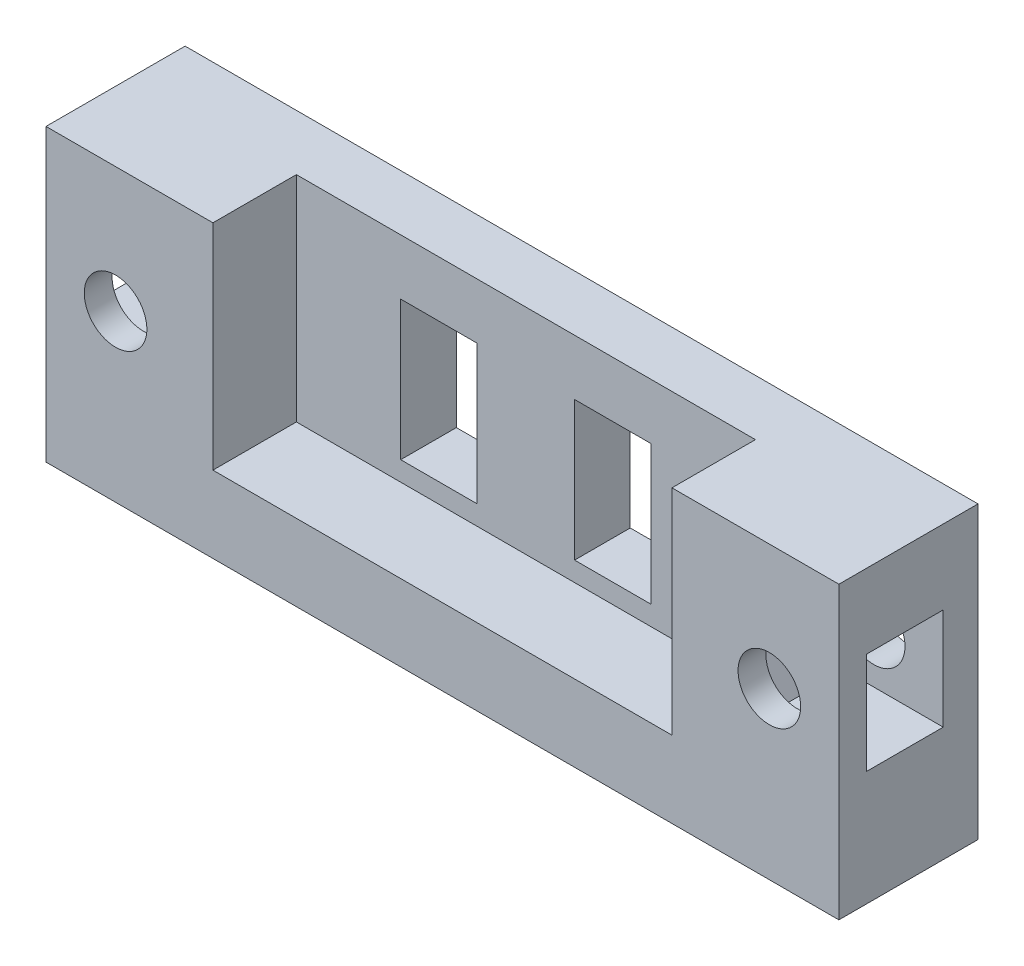
ISO-10303-21;
HEADER;
FILE_DESCRIPTION(('STEP AP214'),'2;1');
FILE_NAME('part.step','',(''),(''),'','','');
FILE_SCHEMA(('AUTOMOTIVE_DESIGN { 1 0 10303 214 1 1 1 1 }'));
ENDSEC;
DATA;
#1=APPLICATION_CONTEXT('core data for automotive mechanical design processes');
#2=APPLICATION_PROTOCOL_DEFINITION('international standard','automotive_design',2000,#1);
#3=PRODUCT_CONTEXT('',#1,'mechanical');
#4=PRODUCT('Part','Part','',(#3));
#5=PRODUCT_RELATED_PRODUCT_CATEGORY('part','',(#4));
#6=PRODUCT_DEFINITION_FORMATION('','',#4);
#7=PRODUCT_DEFINITION_CONTEXT('part definition',#1,'design');
#8=PRODUCT_DEFINITION('design','',#6,#7);
#9=PRODUCT_DEFINITION_SHAPE('','',#8);
#10=(LENGTH_UNIT() NAMED_UNIT(*) SI_UNIT(.MILLI.,.METRE.));
#11=(NAMED_UNIT(*) PLANE_ANGLE_UNIT() SI_UNIT($,.RADIAN.));
#12=(NAMED_UNIT(*) SI_UNIT($,.STERADIAN.) SOLID_ANGLE_UNIT());
#13=UNCERTAINTY_MEASURE_WITH_UNIT(LENGTH_MEASURE(1.E-05),#10,'distance_accuracy_value','');
#14=(GEOMETRIC_REPRESENTATION_CONTEXT(3) GLOBAL_UNCERTAINTY_ASSIGNED_CONTEXT((#13)) GLOBAL_UNIT_ASSIGNED_CONTEXT((#10,
#11,#12)) REPRESENTATION_CONTEXT('',''));
#15=CARTESIAN_POINT('',(0.,0.,0.));
#16=DIRECTION('',(0.,0.,1.));
#17=DIRECTION('',(1.,0.,0.));
#18=AXIS2_PLACEMENT_3D('',#15,#16,#17);
#19=CARTESIAN_POINT('',(0.,0.,4.));
#20=DIRECTION('',(1.,0.,0.));
#21=DIRECTION('',(0.,0.,-1.));
#22=AXIS2_PLACEMENT_3D('',#19,#20,#21);
#23=PLANE('',#22);
#24=DIRECTION('',(0.,-1.,0.));
#25=VECTOR('',#24,1.);
#26=CARTESIAN_POINT('',(0.,0.,0.));
#27=LINE('',#26,#25);
#28=CARTESIAN_POINT('',(0.,0.,0.));
#29=VERTEX_POINT('',#28);
#30=CARTESIAN_POINT('',(0.,-20.9,0.));
#31=VERTEX_POINT('',#30);
#32=EDGE_CURVE('E421',#29,#31,#27,.T.);
#33=ORIENTED_EDGE('',*,*,#32,.T.);
#34=DIRECTION('',(0.,0.,-1.));
#35=VECTOR('',#34,1.);
#36=CARTESIAN_POINT('',(0.,-20.9,4.));
#37=LINE('',#36,#35);
#38=CARTESIAN_POINT('',(0.,-20.9,10.));
#39=VERTEX_POINT('',#38);
#40=EDGE_CURVE('E11',#39,#31,#37,.T.);
#41=ORIENTED_EDGE('',*,*,#40,.F.);
#42=DIRECTION('',(0.,1.,0.));
#43=VECTOR('',#42,1.);
#44=CARTESIAN_POINT('',(0.,0.,10.));
#45=LINE('',#44,#43);
#46=CARTESIAN_POINT('',(0.,0.,10.));
#47=VERTEX_POINT('',#46);
#48=EDGE_CURVE('E269',#39,#47,#45,.T.);
#49=ORIENTED_EDGE('',*,*,#48,.T.);
#50=DIRECTION('',(0.,0.,-1.));
#51=VECTOR('',#50,1.);
#52=CARTESIAN_POINT('',(0.,0.,4.));
#53=LINE('',#52,#51);
#54=EDGE_CURVE('E424',#47,#29,#53,.T.);
#55=ORIENTED_EDGE('',*,*,#54,.T.);
#56=EDGE_LOOP('',(#33,#41,#49,#55));
#57=FACE_BOUND('',#56,.T.);
#58=DIRECTION('',(0.,1.,0.));
#59=VECTOR('',#58,1.);
#60=CARTESIAN_POINT('',(0.,0.,2.5));
#61=LINE('',#60,#59);
#62=CARTESIAN_POINT('',(0.,-12.65,2.5));
#63=VERTEX_POINT('',#62);
#64=CARTESIAN_POINT('',(0.,-5.35000000000004,2.5));
#65=VERTEX_POINT('',#64);
#66=EDGE_CURVE('E229',#63,#65,#61,.T.);
#67=ORIENTED_EDGE('',*,*,#66,.T.);
#68=DIRECTION('',(0.,0.,1.));
#69=VECTOR('',#68,1.);
#70=CARTESIAN_POINT('',(0.,-5.35000000000004,2.5));
#71=LINE('',#70,#69);
#72=CARTESIAN_POINT('',(0.,-5.35000000000004,8.));
#73=VERTEX_POINT('',#72);
#74=EDGE_CURVE('E212',#65,#73,#71,.T.);
#75=ORIENTED_EDGE('',*,*,#74,.T.);
#76=DIRECTION('',(0.,1.,0.));
#77=VECTOR('',#76,1.);
#78=CARTESIAN_POINT('',(0.,0.,8.));
#79=LINE('',#78,#77);
#80=CARTESIAN_POINT('',(0.,-12.65,8.));
#81=VERTEX_POINT('',#80);
#82=EDGE_CURVE('E245',#81,#73,#79,.T.);
#83=ORIENTED_EDGE('',*,*,#82,.F.);
#84=DIRECTION('',(0.,0.,1.));
#85=VECTOR('',#84,1.);
#86=CARTESIAN_POINT('',(0.,-12.65,2.5));
#87=LINE('',#86,#85);
#88=EDGE_CURVE('E51',#63,#81,#87,.T.);
#89=ORIENTED_EDGE('',*,*,#88,.F.);
#90=EDGE_LOOP('',(#67,#75,#83,#89));
#91=FACE_BOUND('',#90,.T.);
#92=ADVANCED_FACE('F37',(#57,#91),#23,.F.);
#93=CARTESIAN_POINT('',(5.,-9.,4.));
#94=DIRECTION('',(0.,0.,-1.));
#95=DIRECTION('',(-1.,0.,0.));
#96=AXIS2_PLACEMENT_3D('',#93,#94,#95);
#97=CYLINDRICAL_SURFACE('',#96,2.25);
#98=CARTESIAN_POINT('',(5.,-9.,0.));
#99=DIRECTION('',(0.,0.,1.));
#100=DIRECTION('',(1.,0.,0.));
#101=AXIS2_PLACEMENT_3D('',#98,#99,#100);
#102=CIRCLE('',#101,2.25);
#103=CARTESIAN_POINT('',(7.25,-9.,0.));
#104=VERTEX_POINT('',#103);
#105=EDGE_CURVE('E418',#104,#104,#102,.T.);
#106=ORIENTED_EDGE('',*,*,#105,.F.);
#107=EDGE_LOOP('',(#106));
#108=FACE_BOUND('',#107,.T.);
#109=CARTESIAN_POINT('',(5.,-9.,2.5));
#110=DIRECTION('',(0.,0.,-1.));
#111=DIRECTION('',(-1.,0.,0.));
#112=AXIS2_PLACEMENT_3D('',#109,#110,#111);
#113=CIRCLE('',#112,2.25);
#114=CARTESIAN_POINT('',(2.75,-9.,2.5));
#115=VERTEX_POINT('',#114);
#116=EDGE_CURVE('E231',#115,#115,#113,.F.);
#117=ORIENTED_EDGE('',*,*,#116,.T.);
#118=EDGE_LOOP('',(#117));
#119=FACE_BOUND('',#118,.T.);
#120=ADVANCED_FACE('F485',(#108,#119),#97,.F.);
#121=CARTESIAN_POINT('',(57.,0.,4.));
#122=DIRECTION('',(-1.,0.,0.));
#123=DIRECTION('',(0.,0.,1.));
#124=AXIS2_PLACEMENT_3D('',#121,#122,#123);
#125=PLANE('',#124);
#126=DIRECTION('',(0.,1.,0.));
#127=VECTOR('',#126,1.);
#128=CARTESIAN_POINT('',(57.,0.,0.));
#129=LINE('',#128,#127);
#130=CARTESIAN_POINT('',(57.,-20.9,0.));
#131=VERTEX_POINT('',#130);
#132=CARTESIAN_POINT('',(57.,0.,0.));
#133=VERTEX_POINT('',#132);
#134=EDGE_CURVE('E430',#131,#133,#129,.T.);
#135=ORIENTED_EDGE('',*,*,#134,.T.);
#136=DIRECTION('',(0.,0.,-1.));
#137=VECTOR('',#136,1.);
#138=CARTESIAN_POINT('',(57.,0.,4.));
#139=LINE('',#138,#137);
#140=CARTESIAN_POINT('',(57.,0.,10.));
#141=VERTEX_POINT('',#140);
#142=EDGE_CURVE('E435',#141,#133,#139,.T.);
#143=ORIENTED_EDGE('',*,*,#142,.F.);
#144=DIRECTION('',(0.,1.,0.));
#145=VECTOR('',#144,1.);
#146=CARTESIAN_POINT('',(57.,0.,10.));
#147=LINE('',#146,#145);
#148=CARTESIAN_POINT('',(57.,-20.9,10.));
#149=VERTEX_POINT('',#148);
#150=EDGE_CURVE('E333',#149,#141,#147,.T.);
#151=ORIENTED_EDGE('',*,*,#150,.F.);
#152=DIRECTION('',(0.,0.,-1.));
#153=VECTOR('',#152,1.);
#154=CARTESIAN_POINT('',(57.,-20.9,4.));
#155=LINE('',#154,#153);
#156=EDGE_CURVE('E44',#149,#131,#155,.T.);
#157=ORIENTED_EDGE('',*,*,#156,.T.);
#158=EDGE_LOOP('',(#135,#143,#151,#157));
#159=FACE_BOUND('',#158,.T.);
#160=DIRECTION('',(0.,1.,0.));
#161=VECTOR('',#160,1.);
#162=CARTESIAN_POINT('',(57.,0.,2.5));
#163=LINE('',#162,#161);
#164=CARTESIAN_POINT('',(57.,-12.65,2.5));
#165=VERTEX_POINT('',#164);
#166=CARTESIAN_POINT('',(57.,-5.35000000000004,2.5));
#167=VERTEX_POINT('',#166);
#168=EDGE_CURVE('E299',#165,#167,#163,.T.);
#169=ORIENTED_EDGE('',*,*,#168,.F.);
#170=DIRECTION('',(0.,0.,1.));
#171=VECTOR('',#170,1.);
#172=CARTESIAN_POINT('',(57.,-12.65,2.5));
#173=LINE('',#172,#171);
#174=CARTESIAN_POINT('',(57.,-12.65,8.));
#175=VERTEX_POINT('',#174);
#176=EDGE_CURVE('E322',#165,#175,#173,.T.);
#177=ORIENTED_EDGE('',*,*,#176,.T.);
#178=DIRECTION('',(0.,1.,0.));
#179=VECTOR('',#178,1.);
#180=CARTESIAN_POINT('',(57.,0.,8.));
#181=LINE('',#180,#179);
#182=CARTESIAN_POINT('',(57.,-5.35000000000003,8.));
#183=VERTEX_POINT('',#182);
#184=EDGE_CURVE('E287',#175,#183,#181,.T.);
#185=ORIENTED_EDGE('',*,*,#184,.T.);
#186=DIRECTION('',(0.,0.,1.));
#187=VECTOR('',#186,1.);
#188=CARTESIAN_POINT('',(57.,-5.35000000000004,2.5));
#189=LINE('',#188,#187);
#190=EDGE_CURVE('E318',#167,#183,#189,.T.);
#191=ORIENTED_EDGE('',*,*,#190,.F.);
#192=EDGE_LOOP('',(#169,#177,#185,#191));
#193=FACE_BOUND('',#192,.T.);
#194=ADVANCED_FACE('F441',(#159,#193),#125,.F.);
#195=CARTESIAN_POINT('',(52.,-9.,4.));
#196=DIRECTION('',(0.,0.,-1.));
#197=DIRECTION('',(-1.,0.,0.));
#198=AXIS2_PLACEMENT_3D('',#195,#196,#197);
#199=CYLINDRICAL_SURFACE('',#198,2.25);
#200=CARTESIAN_POINT('',(52.,-9.,0.));
#201=DIRECTION('',(0.,0.,1.));
#202=DIRECTION('',(1.,0.,0.));
#203=AXIS2_PLACEMENT_3D('',#200,#201,#202);
#204=CIRCLE('',#203,2.25);
#205=CARTESIAN_POINT('',(54.25,-9.,0.));
#206=VERTEX_POINT('',#205);
#207=EDGE_CURVE('E415',#206,#206,#204,.T.);
#208=ORIENTED_EDGE('',*,*,#207,.F.);
#209=EDGE_LOOP('',(#208));
#210=FACE_BOUND('',#209,.T.);
#211=CARTESIAN_POINT('',(52.,-9.,2.5));
#212=DIRECTION('',(0.,0.,1.));
#213=DIRECTION('',(1.,0.,0.));
#214=AXIS2_PLACEMENT_3D('',#211,#212,#213);
#215=CIRCLE('',#214,2.25);
#216=CARTESIAN_POINT('',(54.25,-9.,2.5));
#217=VERTEX_POINT('',#216);
#218=EDGE_CURVE('E283',#217,#217,#215,.F.);
#219=ORIENTED_EDGE('',*,*,#218,.F.);
#220=EDGE_LOOP('',(#219));
#221=FACE_BOUND('',#220,.T.);
#222=ADVANCED_FACE('F496',(#210,#221),#199,.F.);
#223=CARTESIAN_POINT('',(0.,0.,4.));
#224=DIRECTION('',(0.,0.,1.));
#225=DIRECTION('',(1.,0.,0.));
#226=AXIS2_PLACEMENT_3D('',#223,#224,#225);
#227=PLANE('',#226);
#228=DIRECTION('',(0.,-1.,0.));
#229=VECTOR('',#228,1.);
#230=CARTESIAN_POINT('',(12.,0.,4.));
#231=LINE('',#230,#229);
#232=CARTESIAN_POINT('',(12.,0.,4.));
#233=VERTEX_POINT('',#232);
#234=CARTESIAN_POINT('',(12.,-15.4,4.));
#235=VERTEX_POINT('',#234);
#236=EDGE_CURVE('E255',#233,#235,#231,.T.);
#237=ORIENTED_EDGE('',*,*,#236,.T.);
#238=DIRECTION('',(-1.,0.,0.));
#239=VECTOR('',#238,1.);
#240=CARTESIAN_POINT('',(0.,-15.4,4.));
#241=LINE('',#240,#239);
#242=CARTESIAN_POINT('',(45.,-15.4,4.));
#243=VERTEX_POINT('',#242);
#244=EDGE_CURVE('E59',#243,#235,#241,.T.);
#245=ORIENTED_EDGE('',*,*,#244,.F.);
#246=DIRECTION('',(0.,-1.,0.));
#247=VECTOR('',#246,1.);
#248=CARTESIAN_POINT('',(45.,0.,4.));
#249=LINE('',#248,#247);
#250=CARTESIAN_POINT('',(45.,0.,4.));
#251=VERTEX_POINT('',#250);
#252=EDGE_CURVE('E321',#251,#243,#249,.T.);
#253=ORIENTED_EDGE('',*,*,#252,.F.);
#254=DIRECTION('',(-1.,0.,0.));
#255=VECTOR('',#254,1.);
#256=CARTESIAN_POINT('',(0.,0.,4.));
#257=LINE('',#256,#255);
#258=EDGE_CURVE('E422',#251,#233,#257,.T.);
#259=ORIENTED_EDGE('',*,*,#258,.T.);
#260=EDGE_LOOP('',(#237,#245,#253,#259));
#261=FACE_BOUND('',#260,.T.);
#262=DIRECTION('',(-1.,0.,0.));
#263=VECTOR('',#262,1.);
#264=CARTESIAN_POINT('',(25.,-4.,4.));
#265=LINE('',#264,#263);
#266=CARTESIAN_POINT('',(25.,-4.,4.));
#267=VERTEX_POINT('',#266);
#268=CARTESIAN_POINT('',(19.5,-4.,4.));
#269=VERTEX_POINT('',#268);
#270=EDGE_CURVE('E356',#267,#269,#265,.T.);
#271=ORIENTED_EDGE('',*,*,#270,.F.);
#272=DIRECTION('',(0.,1.,0.));
#273=VECTOR('',#272,1.);
#274=CARTESIAN_POINT('',(25.,-4.,4.));
#275=LINE('',#274,#273);
#276=CARTESIAN_POINT('',(25.,-14.,4.));
#277=VERTEX_POINT('',#276);
#278=EDGE_CURVE('E354',#277,#267,#275,.T.);
#279=ORIENTED_EDGE('',*,*,#278,.F.);
#280=DIRECTION('',(1.,0.,0.));
#281=VECTOR('',#280,1.);
#282=CARTESIAN_POINT('',(25.,-14.,4.));
#283=LINE('',#282,#281);
#284=CARTESIAN_POINT('',(19.5,-14.,4.));
#285=VERTEX_POINT('',#284);
#286=EDGE_CURVE('E362',#285,#277,#283,.T.);
#287=ORIENTED_EDGE('',*,*,#286,.F.);
#288=DIRECTION('',(0.,-1.,0.));
#289=VECTOR('',#288,1.);
#290=CARTESIAN_POINT('',(19.5,-4.,4.));
#291=LINE('',#290,#289);
#292=EDGE_CURVE('E359',#269,#285,#291,.T.);
#293=ORIENTED_EDGE('',*,*,#292,.F.);
#294=EDGE_LOOP('',(#271,#279,#287,#293));
#295=FACE_BOUND('',#294,.T.);
#296=DIRECTION('',(-1.,0.,0.));
#297=VECTOR('',#296,1.);
#298=CARTESIAN_POINT('',(37.5,-4.,4.));
#299=LINE('',#298,#297);
#300=CARTESIAN_POINT('',(37.5,-4.,4.));
#301=VERTEX_POINT('',#300);
#302=CARTESIAN_POINT('',(32.,-4.,4.));
#303=VERTEX_POINT('',#302);
#304=EDGE_CURVE('E387',#301,#303,#299,.T.);
#305=ORIENTED_EDGE('',*,*,#304,.F.);
#306=DIRECTION('',(0.,1.,0.));
#307=VECTOR('',#306,1.);
#308=CARTESIAN_POINT('',(37.5,-4.,4.));
#309=LINE('',#308,#307);
#310=CARTESIAN_POINT('',(37.5,-14.,4.));
#311=VERTEX_POINT('',#310);
#312=EDGE_CURVE('E385',#311,#301,#309,.T.);
#313=ORIENTED_EDGE('',*,*,#312,.F.);
#314=DIRECTION('',(1.,0.,0.));
#315=VECTOR('',#314,1.);
#316=CARTESIAN_POINT('',(37.5,-14.,4.));
#317=LINE('',#316,#315);
#318=CARTESIAN_POINT('',(32.,-14.,4.));
#319=VERTEX_POINT('',#318);
#320=EDGE_CURVE('E393',#319,#311,#317,.T.);
#321=ORIENTED_EDGE('',*,*,#320,.F.);
#322=DIRECTION('',(0.,-1.,0.));
#323=VECTOR('',#322,1.);
#324=CARTESIAN_POINT('',(32.,-4.,4.));
#325=LINE('',#324,#323);
#326=EDGE_CURVE('E390',#303,#319,#325,.T.);
#327=ORIENTED_EDGE('',*,*,#326,.F.);
#328=EDGE_LOOP('',(#305,#313,#321,#327));
#329=FACE_BOUND('',#328,.T.);
#330=ADVANCED_FACE('F466',(#261,#295,#329),#227,.T.);
#331=CARTESIAN_POINT('',(0.,0.,0.));
#332=DIRECTION('',(0.,0.,1.));
#333=DIRECTION('',(1.,0.,0.));
#334=AXIS2_PLACEMENT_3D('',#331,#332,#333);
#335=PLANE('',#334);
#336=DIRECTION('',(0.,1.,0.));
#337=VECTOR('',#336,1.);
#338=CARTESIAN_POINT('',(37.5,-4.,0.));
#339=LINE('',#338,#337);
#340=CARTESIAN_POINT('',(37.5,-14.,0.));
#341=VERTEX_POINT('',#340);
#342=CARTESIAN_POINT('',(37.5,-4.,0.));
#343=VERTEX_POINT('',#342);
#344=EDGE_CURVE('E384',#341,#343,#339,.T.);
#345=ORIENTED_EDGE('',*,*,#344,.T.);
#346=DIRECTION('',(-1.,0.,0.));
#347=VECTOR('',#346,1.);
#348=CARTESIAN_POINT('',(37.5,-4.,0.));
#349=LINE('',#348,#347);
#350=CARTESIAN_POINT('',(32.,-4.,0.));
#351=VERTEX_POINT('',#350);
#352=EDGE_CURVE('E398',#343,#351,#349,.T.);
#353=ORIENTED_EDGE('',*,*,#352,.T.);
#354=DIRECTION('',(0.,-1.,0.));
#355=VECTOR('',#354,1.);
#356=CARTESIAN_POINT('',(32.,-4.,0.));
#357=LINE('',#356,#355);
#358=CARTESIAN_POINT('',(32.,-14.,0.));
#359=VERTEX_POINT('',#358);
#360=EDGE_CURVE('E401',#351,#359,#357,.T.);
#361=ORIENTED_EDGE('',*,*,#360,.T.);
#362=DIRECTION('',(1.,0.,0.));
#363=VECTOR('',#362,1.);
#364=CARTESIAN_POINT('',(37.5,-14.,0.));
#365=LINE('',#364,#363);
#366=EDGE_CURVE('E388',#359,#341,#365,.T.);
#367=ORIENTED_EDGE('',*,*,#366,.T.);
#368=EDGE_LOOP('',(#345,#353,#361,#367));
#369=FACE_BOUND('',#368,.T.);
#370=ORIENTED_EDGE('',*,*,#32,.F.);
#371=DIRECTION('',(-1.,0.,0.));
#372=VECTOR('',#371,1.);
#373=CARTESIAN_POINT('',(0.,0.,0.));
#374=LINE('',#373,#372);
#375=EDGE_CURVE('E425',#133,#29,#374,.T.);
#376=ORIENTED_EDGE('',*,*,#375,.F.);
#377=ORIENTED_EDGE('',*,*,#134,.F.);
#378=DIRECTION('',(1.,0.,0.));
#379=VECTOR('',#378,1.);
#380=CARTESIAN_POINT('',(0.,-20.9,0.));
#381=LINE('',#380,#379);
#382=EDGE_CURVE('E428',#31,#131,#381,.T.);
#383=ORIENTED_EDGE('',*,*,#382,.F.);
#384=EDGE_LOOP('',(#370,#376,#377,#383));
#385=FACE_BOUND('',#384,.T.);
#386=ORIENTED_EDGE('',*,*,#105,.T.);
#387=EDGE_LOOP('',(#386));
#388=FACE_BOUND('',#387,.T.);
#389=ORIENTED_EDGE('',*,*,#207,.T.);
#390=EDGE_LOOP('',(#389));
#391=FACE_BOUND('',#390,.T.);
#392=DIRECTION('',(0.,1.,0.));
#393=VECTOR('',#392,1.);
#394=CARTESIAN_POINT('',(25.,-4.,0.));
#395=LINE('',#394,#393);
#396=CARTESIAN_POINT('',(25.,-14.,0.));
#397=VERTEX_POINT('',#396);
#398=CARTESIAN_POINT('',(25.,-4.,0.));
#399=VERTEX_POINT('',#398);
#400=EDGE_CURVE('E353',#397,#399,#395,.T.);
#401=ORIENTED_EDGE('',*,*,#400,.T.);
#402=DIRECTION('',(-1.,0.,0.));
#403=VECTOR('',#402,1.);
#404=CARTESIAN_POINT('',(25.,-4.,0.));
#405=LINE('',#404,#403);
#406=CARTESIAN_POINT('',(19.5,-4.,0.));
#407=VERTEX_POINT('',#406);
#408=EDGE_CURVE('E367',#399,#407,#405,.T.);
#409=ORIENTED_EDGE('',*,*,#408,.T.);
#410=DIRECTION('',(0.,-1.,0.));
#411=VECTOR('',#410,1.);
#412=CARTESIAN_POINT('',(19.5,-4.,0.));
#413=LINE('',#412,#411);
#414=CARTESIAN_POINT('',(19.5,-14.,0.));
#415=VERTEX_POINT('',#414);
#416=EDGE_CURVE('E370',#407,#415,#413,.T.);
#417=ORIENTED_EDGE('',*,*,#416,.T.);
#418=DIRECTION('',(1.,0.,0.));
#419=VECTOR('',#418,1.);
#420=CARTESIAN_POINT('',(25.,-14.,0.));
#421=LINE('',#420,#419);
#422=EDGE_CURVE('E357',#415,#397,#421,.T.);
#423=ORIENTED_EDGE('',*,*,#422,.T.);
#424=EDGE_LOOP('',(#401,#409,#417,#423));
#425=FACE_BOUND('',#424,.T.);
#426=ADVANCED_FACE('F448',(#369,#385,#388,#391,#425),#335,.F.);
#427=CARTESIAN_POINT('',(0.,-20.9,4.));
#428=DIRECTION('',(0.,1.,0.));
#429=DIRECTION('',(0.,0.,1.));
#430=AXIS2_PLACEMENT_3D('',#427,#428,#429);
#431=PLANE('',#430);
#432=ORIENTED_EDGE('',*,*,#382,.T.);
#433=ORIENTED_EDGE('',*,*,#156,.F.);
#434=DIRECTION('',(1.,0.,0.));
#435=VECTOR('',#434,1.);
#436=CARTESIAN_POINT('',(0.,-20.9,10.));
#437=LINE('',#436,#435);
#438=EDGE_CURVE('E330',#39,#149,#437,.T.);
#439=ORIENTED_EDGE('',*,*,#438,.F.);
#440=ORIENTED_EDGE('',*,*,#40,.T.);
#441=EDGE_LOOP('',(#432,#433,#439,#440));
#442=FACE_BOUND('',#441,.T.);
#443=ADVANCED_FACE('F511',(#442),#431,.F.);
#444=CARTESIAN_POINT('',(0.,0.,4.));
#445=DIRECTION('',(0.,-1.,0.));
#446=DIRECTION('',(0.,0.,-1.));
#447=AXIS2_PLACEMENT_3D('',#444,#445,#446);
#448=PLANE('',#447);
#449=ORIENTED_EDGE('',*,*,#375,.T.);
#450=ORIENTED_EDGE('',*,*,#54,.F.);
#451=DIRECTION('',(1.,0.,0.));
#452=VECTOR('',#451,1.);
#453=CARTESIAN_POINT('',(57.,0.,10.));
#454=LINE('',#453,#452);
#455=CARTESIAN_POINT('',(12.,0.,10.));
#456=VERTEX_POINT('',#455);
#457=EDGE_CURVE('E266',#47,#456,#454,.T.);
#458=ORIENTED_EDGE('',*,*,#457,.T.);
#459=DIRECTION('',(0.,0.,-1.));
#460=VECTOR('',#459,1.);
#461=CARTESIAN_POINT('',(12.,0.,10.));
#462=LINE('',#461,#460);
#463=EDGE_CURVE('E275',#456,#233,#462,.T.);
#464=ORIENTED_EDGE('',*,*,#463,.T.);
#465=ORIENTED_EDGE('',*,*,#258,.F.);
#466=DIRECTION('',(0.,0.,-1.));
#467=VECTOR('',#466,1.);
#468=CARTESIAN_POINT('',(45.,0.,10.));
#469=LINE('',#468,#467);
#470=CARTESIAN_POINT('',(45.,0.,10.));
#471=VERTEX_POINT('',#470);
#472=EDGE_CURVE('E350',#471,#251,#469,.T.);
#473=ORIENTED_EDGE('',*,*,#472,.F.);
#474=DIRECTION('',(-1.,0.,0.));
#475=VECTOR('',#474,1.);
#476=CARTESIAN_POINT('',(0.,0.,10.));
#477=LINE('',#476,#475);
#478=EDGE_CURVE('E336',#141,#471,#477,.T.);
#479=ORIENTED_EDGE('',*,*,#478,.F.);
#480=ORIENTED_EDGE('',*,*,#142,.T.);
#481=EDGE_LOOP('',(#449,#450,#458,#464,#465,#473,#479,#480));
#482=FACE_BOUND('',#481,.T.);
#483=ADVANCED_FACE('F451',(#482),#448,.F.);
#484=CARTESIAN_POINT('',(5.,-9.,8.));
#485=DIRECTION('',(0.,0.,-1.));
#486=DIRECTION('',(-1.,0.,0.));
#487=AXIS2_PLACEMENT_3D('',#484,#485,#486);
#488=CIRCLE('',#487,2.25);
#489=CARTESIAN_POINT('',(2.75,-9.,8.));
#490=VERTEX_POINT('',#489);
#491=EDGE_CURVE('E241',#490,#490,#488,.F.);
#492=ORIENTED_EDGE('',*,*,#491,.F.);
#493=EDGE_LOOP('',(#492));
#494=FACE_BOUND('',#493,.T.);
#495=CARTESIAN_POINT('',(5.,-9.,10.));
#496=DIRECTION('',(0.,0.,-1.));
#497=DIRECTION('',(-1.,0.,0.));
#498=AXIS2_PLACEMENT_3D('',#495,#496,#497);
#499=CIRCLE('',#498,2.25);
#500=CARTESIAN_POINT('',(2.75,-9.,10.));
#501=VERTEX_POINT('',#500);
#502=EDGE_CURVE('E272',#501,#501,#499,.F.);
#503=ORIENTED_EDGE('',*,*,#502,.T.);
#504=EDGE_LOOP('',(#503));
#505=FACE_BOUND('',#504,.T.);
#506=ADVANCED_FACE('F492',(#494,#505),#97,.F.);
#507=CARTESIAN_POINT('',(52.,-9.,8.));
#508=DIRECTION('',(0.,0.,1.));
#509=DIRECTION('',(1.,0.,0.));
#510=AXIS2_PLACEMENT_3D('',#507,#508,#509);
#511=CIRCLE('',#510,2.25);
#512=CARTESIAN_POINT('',(54.25,-9.,8.));
#513=VERTEX_POINT('',#512);
#514=EDGE_CURVE('E282',#513,#513,#511,.F.);
#515=ORIENTED_EDGE('',*,*,#514,.T.);
#516=EDGE_LOOP('',(#515));
#517=FACE_BOUND('',#516,.T.);
#518=CARTESIAN_POINT('',(52.,-9.,10.));
#519=DIRECTION('',(0.,0.,1.));
#520=DIRECTION('',(1.,0.,0.));
#521=AXIS2_PLACEMENT_3D('',#518,#519,#520);
#522=CIRCLE('',#521,2.25);
#523=CARTESIAN_POINT('',(54.25,-9.,10.));
#524=VERTEX_POINT('',#523);
#525=EDGE_CURVE('E342',#524,#524,#522,.F.);
#526=ORIENTED_EDGE('',*,*,#525,.F.);
#527=EDGE_LOOP('',(#526));
#528=FACE_BOUND('',#527,.T.);
#529=ADVANCED_FACE('F503',(#517,#528),#199,.F.);
#530=CARTESIAN_POINT('',(37.5,-4.,4.));
#531=DIRECTION('',(-1.,0.,0.));
#532=DIRECTION('',(0.,-1.,0.));
#533=AXIS2_PLACEMENT_3D('',#530,#531,#532);
#534=PLANE('',#533);
#535=ORIENTED_EDGE('',*,*,#344,.F.);
#536=DIRECTION('',(0.,0.,-1.));
#537=VECTOR('',#536,1.);
#538=CARTESIAN_POINT('',(37.5,-14.,4.));
#539=LINE('',#538,#537);
#540=EDGE_CURVE('E395',#311,#341,#539,.T.);
#541=ORIENTED_EDGE('',*,*,#540,.F.);
#542=ORIENTED_EDGE('',*,*,#312,.T.);
#543=DIRECTION('',(0.,0.,-1.));
#544=VECTOR('',#543,1.);
#545=CARTESIAN_POINT('',(37.5,-4.,4.));
#546=LINE('',#545,#544);
#547=EDGE_CURVE('E412',#301,#343,#546,.T.);
#548=ORIENTED_EDGE('',*,*,#547,.T.);
#549=EDGE_LOOP('',(#535,#541,#542,#548));
#550=FACE_BOUND('',#549,.T.);
#551=ADVANCED_FACE('F509',(#550),#534,.T.);
#552=CARTESIAN_POINT('',(37.5,-4.,4.));
#553=DIRECTION('',(0.,-1.,0.));
#554=DIRECTION('',(1.,0.,0.));
#555=AXIS2_PLACEMENT_3D('',#552,#553,#554);
#556=PLANE('',#555);
#557=ORIENTED_EDGE('',*,*,#352,.F.);
#558=ORIENTED_EDGE('',*,*,#547,.F.);
#559=ORIENTED_EDGE('',*,*,#304,.T.);
#560=DIRECTION('',(0.,0.,-1.));
#561=VECTOR('',#560,1.);
#562=CARTESIAN_POINT('',(32.,-4.,4.));
#563=LINE('',#562,#561);
#564=EDGE_CURVE('E410',#303,#351,#563,.T.);
#565=ORIENTED_EDGE('',*,*,#564,.T.);
#566=EDGE_LOOP('',(#557,#558,#559,#565));
#567=FACE_BOUND('',#566,.T.);
#568=ADVANCED_FACE('F864',(#567),#556,.T.);
#569=CARTESIAN_POINT('',(32.,-4.,4.));
#570=DIRECTION('',(1.,0.,0.));
#571=DIRECTION('',(0.,0.,-1.));
#572=AXIS2_PLACEMENT_3D('',#569,#570,#571);
#573=PLANE('',#572);
#574=ORIENTED_EDGE('',*,*,#360,.F.);
#575=ORIENTED_EDGE('',*,*,#564,.F.);
#576=ORIENTED_EDGE('',*,*,#326,.T.);
#577=DIRECTION('',(0.,0.,-1.));
#578=VECTOR('',#577,1.);
#579=CARTESIAN_POINT('',(32.,-14.,4.));
#580=LINE('',#579,#578);
#581=EDGE_CURVE('E408',#319,#359,#580,.T.);
#582=ORIENTED_EDGE('',*,*,#581,.T.);
#583=EDGE_LOOP('',(#574,#575,#576,#582));
#584=FACE_BOUND('',#583,.T.);
#585=ADVANCED_FACE('F854',(#584),#573,.T.);
#586=CARTESIAN_POINT('',(37.5,-14.,4.));
#587=DIRECTION('',(0.,1.,0.));
#588=DIRECTION('',(0.,0.,1.));
#589=AXIS2_PLACEMENT_3D('',#586,#587,#588);
#590=PLANE('',#589);
#591=ORIENTED_EDGE('',*,*,#366,.F.);
#592=ORIENTED_EDGE('',*,*,#581,.F.);
#593=ORIENTED_EDGE('',*,*,#320,.T.);
#594=ORIENTED_EDGE('',*,*,#540,.T.);
#595=EDGE_LOOP('',(#591,#592,#593,#594));
#596=FACE_BOUND('',#595,.T.);
#597=ADVANCED_FACE('F844',(#596),#590,.T.);
#598=CARTESIAN_POINT('',(25.,-4.,4.));
#599=DIRECTION('',(-1.,0.,0.));
#600=DIRECTION('',(0.,0.,1.));
#601=AXIS2_PLACEMENT_3D('',#598,#599,#600);
#602=PLANE('',#601);
#603=ORIENTED_EDGE('',*,*,#400,.F.);
#604=DIRECTION('',(0.,0.,-1.));
#605=VECTOR('',#604,1.);
#606=CARTESIAN_POINT('',(25.,-14.,4.));
#607=LINE('',#606,#605);
#608=EDGE_CURVE('E364',#277,#397,#607,.T.);
#609=ORIENTED_EDGE('',*,*,#608,.F.);
#610=ORIENTED_EDGE('',*,*,#278,.T.);
#611=DIRECTION('',(0.,0.,-1.));
#612=VECTOR('',#611,1.);
#613=CARTESIAN_POINT('',(25.,-4.,4.));
#614=LINE('',#613,#612);
#615=EDGE_CURVE('E381',#267,#399,#614,.T.);
#616=ORIENTED_EDGE('',*,*,#615,.T.);
#617=EDGE_LOOP('',(#603,#609,#610,#616));
#618=FACE_BOUND('',#617,.T.);
#619=ADVANCED_FACE('F834',(#618),#602,.T.);
#620=CARTESIAN_POINT('',(25.,-4.,4.));
#621=DIRECTION('',(0.,-1.,0.));
#622=DIRECTION('',(1.,0.,0.));
#623=AXIS2_PLACEMENT_3D('',#620,#621,#622);
#624=PLANE('',#623);
#625=ORIENTED_EDGE('',*,*,#408,.F.);
#626=ORIENTED_EDGE('',*,*,#615,.F.);
#627=ORIENTED_EDGE('',*,*,#270,.T.);
#628=DIRECTION('',(0.,0.,-1.));
#629=VECTOR('',#628,1.);
#630=CARTESIAN_POINT('',(19.5,-4.,4.));
#631=LINE('',#630,#629);
#632=EDGE_CURVE('E379',#269,#407,#631,.T.);
#633=ORIENTED_EDGE('',*,*,#632,.T.);
#634=EDGE_LOOP('',(#625,#626,#627,#633));
#635=FACE_BOUND('',#634,.T.);
#636=ADVANCED_FACE('F824',(#635),#624,.T.);
#637=CARTESIAN_POINT('',(19.5,-4.,4.));
#638=DIRECTION('',(1.,0.,0.));
#639=DIRECTION('',(0.,0.,-1.));
#640=AXIS2_PLACEMENT_3D('',#637,#638,#639);
#641=PLANE('',#640);
#642=ORIENTED_EDGE('',*,*,#416,.F.);
#643=ORIENTED_EDGE('',*,*,#632,.F.);
#644=ORIENTED_EDGE('',*,*,#292,.T.);
#645=DIRECTION('',(0.,0.,-1.));
#646=VECTOR('',#645,1.);
#647=CARTESIAN_POINT('',(19.5,-14.,4.));
#648=LINE('',#647,#646);
#649=EDGE_CURVE('E377',#285,#415,#648,.T.);
#650=ORIENTED_EDGE('',*,*,#649,.T.);
#651=EDGE_LOOP('',(#642,#643,#644,#650));
#652=FACE_BOUND('',#651,.T.);
#653=ADVANCED_FACE('F814',(#652),#641,.T.);
#654=CARTESIAN_POINT('',(25.,-14.,4.));
#655=DIRECTION('',(0.,1.,0.));
#656=DIRECTION('',(0.,0.,1.));
#657=AXIS2_PLACEMENT_3D('',#654,#655,#656);
#658=PLANE('',#657);
#659=ORIENTED_EDGE('',*,*,#422,.F.);
#660=ORIENTED_EDGE('',*,*,#649,.F.);
#661=ORIENTED_EDGE('',*,*,#286,.T.);
#662=ORIENTED_EDGE('',*,*,#608,.T.);
#663=EDGE_LOOP('',(#659,#660,#661,#662));
#664=FACE_BOUND('',#663,.T.);
#665=ADVANCED_FACE('F482',(#664),#658,.T.);
#666=CARTESIAN_POINT('',(45.,0.,10.));
#667=DIRECTION('',(1.,0.,0.));
#668=DIRECTION('',(0.,0.,-1.));
#669=AXIS2_PLACEMENT_3D('',#666,#667,#668);
#670=PLANE('',#669);
#671=ORIENTED_EDGE('',*,*,#252,.T.);
#672=DIRECTION('',(0.,0.,-1.));
#673=VECTOR('',#672,1.);
#674=CARTESIAN_POINT('',(45.,-15.4,10.));
#675=LINE('',#674,#673);
#676=CARTESIAN_POINT('',(45.,-15.4,10.));
#677=VERTEX_POINT('',#676);
#678=EDGE_CURVE('E345',#677,#243,#675,.T.);
#679=ORIENTED_EDGE('',*,*,#678,.F.);
#680=DIRECTION('',(0.,-1.,0.));
#681=VECTOR('',#680,1.);
#682=CARTESIAN_POINT('',(45.,0.,10.));
#683=LINE('',#682,#681);
#684=EDGE_CURVE('E338',#471,#677,#683,.T.);
#685=ORIENTED_EDGE('',*,*,#684,.F.);
#686=ORIENTED_EDGE('',*,*,#472,.T.);
#687=EDGE_LOOP('',(#671,#679,#685,#686));
#688=FACE_BOUND('',#687,.T.);
#689=ADVANCED_FACE('F470',(#688),#670,.F.);
#690=CARTESIAN_POINT('',(0.,-15.4,10.));
#691=DIRECTION('',(0.,-1.,0.));
#692=DIRECTION('',(1.,0.,0.));
#693=AXIS2_PLACEMENT_3D('',#690,#691,#692);
#694=PLANE('',#693);
#695=ORIENTED_EDGE('',*,*,#244,.T.);
#696=DIRECTION('',(0.,0.,-1.));
#697=VECTOR('',#696,1.);
#698=CARTESIAN_POINT('',(12.,-15.4,10.));
#699=LINE('',#698,#697);
#700=CARTESIAN_POINT('',(12.,-15.4,10.));
#701=VERTEX_POINT('',#700);
#702=EDGE_CURVE('E279',#701,#235,#699,.T.);
#703=ORIENTED_EDGE('',*,*,#702,.F.);
#704=DIRECTION('',(-1.,0.,0.));
#705=VECTOR('',#704,1.);
#706=CARTESIAN_POINT('',(0.,-15.4,10.));
#707=LINE('',#706,#705);
#708=EDGE_CURVE('E340',#677,#701,#707,.T.);
#709=ORIENTED_EDGE('',*,*,#708,.F.);
#710=ORIENTED_EDGE('',*,*,#678,.T.);
#711=EDGE_LOOP('',(#695,#703,#709,#710));
#712=FACE_BOUND('',#711,.T.);
#713=ADVANCED_FACE('F473',(#712),#694,.F.);
#714=CARTESIAN_POINT('',(0.,0.,10.));
#715=DIRECTION('',(0.,0.,1.));
#716=DIRECTION('',(1.,0.,0.));
#717=AXIS2_PLACEMENT_3D('',#714,#715,#716);
#718=PLANE('',#717);
#719=ORIENTED_EDGE('',*,*,#708,.T.);
#720=DIRECTION('',(0.,-1.,0.));
#721=VECTOR('',#720,1.);
#722=CARTESIAN_POINT('',(12.,0.,10.));
#723=LINE('',#722,#721);
#724=EDGE_CURVE('E263',#456,#701,#723,.T.);
#725=ORIENTED_EDGE('',*,*,#724,.F.);
#726=ORIENTED_EDGE('',*,*,#457,.F.);
#727=ORIENTED_EDGE('',*,*,#48,.F.);
#728=ORIENTED_EDGE('',*,*,#438,.T.);
#729=ORIENTED_EDGE('',*,*,#150,.T.);
#730=ORIENTED_EDGE('',*,*,#478,.T.);
#731=ORIENTED_EDGE('',*,*,#684,.T.);
#732=EDGE_LOOP('',(#719,#725,#726,#727,#728,#729,#730,#731));
#733=FACE_BOUND('',#732,.T.);
#734=ORIENTED_EDGE('',*,*,#525,.T.);
#735=EDGE_LOOP('',(#734));
#736=FACE_BOUND('',#735,.T.);
#737=ORIENTED_EDGE('',*,*,#502,.F.);
#738=EDGE_LOOP('',(#737));
#739=FACE_BOUND('',#738,.T.);
#740=ADVANCED_FACE('F457',(#733,#736,#739),#718,.T.);
#741=CARTESIAN_POINT('',(0.,-5.35000000000007,2.5));
#742=DIRECTION('',(0.,1.,0.));
#743=DIRECTION('',(-1.,0.,0.));
#744=AXIS2_PLACEMENT_3D('',#741,#742,#743);
#745=PLANE('',#744);
#746=DIRECTION('',(-1.,0.,0.));
#747=VECTOR('',#746,1.);
#748=CARTESIAN_POINT('',(0.,-5.35000000000007,8.));
#749=LINE('',#748,#747);
#750=CARTESIAN_POINT('',(49.8926715174579,-5.35000000000003,8.));
#751=VERTEX_POINT('',#750);
#752=EDGE_CURVE('E305',#183,#751,#749,.T.);
#753=ORIENTED_EDGE('',*,*,#752,.T.);
#754=DIRECTION('',(0.,0.,1.));
#755=VECTOR('',#754,1.);
#756=CARTESIAN_POINT('',(49.8926715174579,-5.35000000000003,2.5));
#757=LINE('',#756,#755);
#758=CARTESIAN_POINT('',(49.8926715174579,-5.35000000000003,2.5));
#759=VERTEX_POINT('',#758);
#760=EDGE_CURVE('E302',#759,#751,#757,.T.);
#761=ORIENTED_EDGE('',*,*,#760,.F.);
#762=DIRECTION('',(-1.,0.,0.));
#763=VECTOR('',#762,1.);
#764=CARTESIAN_POINT('',(0.,-5.35000000000007,2.5));
#765=LINE('',#764,#763);
#766=EDGE_CURVE('E286',#167,#759,#765,.T.);
#767=ORIENTED_EDGE('',*,*,#766,.F.);
#768=ORIENTED_EDGE('',*,*,#190,.T.);
#769=EDGE_LOOP('',(#753,#761,#767,#768));
#770=FACE_BOUND('',#769,.T.);
#771=ADVANCED_FACE('F480',(#770),#745,.F.);
#772=CARTESIAN_POINT('',(0.,-12.65,2.5));
#773=DIRECTION('',(0.,-1.,0.));
#774=DIRECTION('',(1.,0.,0.));
#775=AXIS2_PLACEMENT_3D('',#772,#773,#774);
#776=PLANE('',#775);
#777=DIRECTION('',(1.,0.,0.));
#778=VECTOR('',#777,1.);
#779=CARTESIAN_POINT('',(0.,-12.65,8.));
#780=LINE('',#779,#778);
#781=CARTESIAN_POINT('',(49.8926715174579,-12.65,8.));
#782=VERTEX_POINT('',#781);
#783=EDGE_CURVE('E314',#782,#175,#780,.T.);
#784=ORIENTED_EDGE('',*,*,#783,.T.);
#785=ORIENTED_EDGE('',*,*,#176,.F.);
#786=DIRECTION('',(1.,0.,0.));
#787=VECTOR('',#786,1.);
#788=CARTESIAN_POINT('',(0.,-12.65,2.5));
#789=LINE('',#788,#787);
#790=CARTESIAN_POINT('',(49.8926715174579,-12.65,2.5));
#791=VERTEX_POINT('',#790);
#792=EDGE_CURVE('E296',#791,#165,#789,.T.);
#793=ORIENTED_EDGE('',*,*,#792,.F.);
#794=DIRECTION('',(0.,0.,1.));
#795=VECTOR('',#794,1.);
#796=CARTESIAN_POINT('',(49.8926715174579,-12.65,2.5));
#797=LINE('',#796,#795);
#798=EDGE_CURVE('E325',#791,#782,#797,.T.);
#799=ORIENTED_EDGE('',*,*,#798,.T.);
#800=EDGE_LOOP('',(#784,#785,#793,#799));
#801=FACE_BOUND('',#800,.T.);
#802=ADVANCED_FACE('F553',(#801),#776,.F.);
#803=CARTESIAN_POINT('',(31.941892959157,18.4416604983953,2.5));
#804=DIRECTION('',(-0.866025403784441,-0.499999999999996,0.));
#805=DIRECTION('',(0.499999999999996,-0.866025403784441,0.));
#806=AXIS2_PLACEMENT_3D('',#803,#804,#805);
#807=PLANE('',#806);
#808=DIRECTION('',(0.499999999999996,-0.866025403784441,0.));
#809=VECTOR('',#808,1.);
#810=CARTESIAN_POINT('',(31.941892959157,18.4416604983953,8.));
#811=LINE('',#810,#809);
#812=CARTESIAN_POINT('',(47.7853430349157,-9.00000000000002,8.));
#813=VERTEX_POINT('',#812);
#814=EDGE_CURVE('E311',#813,#782,#811,.T.);
#815=ORIENTED_EDGE('',*,*,#814,.T.);
#816=ORIENTED_EDGE('',*,*,#798,.F.);
#817=DIRECTION('',(0.499999999999996,-0.866025403784441,0.));
#818=VECTOR('',#817,1.);
#819=CARTESIAN_POINT('',(31.941892959157,18.4416604983953,2.5));
#820=LINE('',#819,#818);
#821=CARTESIAN_POINT('',(47.7853430349157,-9.00000000000002,2.5));
#822=VERTEX_POINT('',#821);
#823=EDGE_CURVE('E293',#822,#791,#820,.T.);
#824=ORIENTED_EDGE('',*,*,#823,.F.);
#825=DIRECTION('',(0.,0.,1.));
#826=VECTOR('',#825,1.);
#827=CARTESIAN_POINT('',(47.7853430349157,-9.00000000000002,2.5));
#828=LINE('',#827,#826);
#829=EDGE_CURVE('E327',#822,#813,#828,.T.);
#830=ORIENTED_EDGE('',*,*,#829,.T.);
#831=EDGE_LOOP('',(#815,#816,#824,#830));
#832=FACE_BOUND('',#831,.T.);
#833=ADVANCED_FACE('F556',(#832),#807,.F.);
#834=CARTESIAN_POINT('',(39.7361215932167,-22.9416604983955,2.5));
#835=DIRECTION('',(-0.866025403784437,0.500000000000003,0.));
#836=DIRECTION('',(-0.500000000000003,-0.866025403784437,0.));
#837=AXIS2_PLACEMENT_3D('',#834,#835,#836);
#838=PLANE('',#837);
#839=DIRECTION('',(-0.500000000000003,-0.866025403784437,0.));
#840=VECTOR('',#839,1.);
#841=CARTESIAN_POINT('',(39.7361215932167,-22.9416604983955,8.));
#842=LINE('',#841,#840);
#843=EDGE_CURVE('E308',#751,#813,#842,.T.);
#844=ORIENTED_EDGE('',*,*,#843,.T.);
#845=ORIENTED_EDGE('',*,*,#829,.F.);
#846=DIRECTION('',(-0.500000000000003,-0.866025403784437,0.));
#847=VECTOR('',#846,1.);
#848=CARTESIAN_POINT('',(39.7361215932167,-22.9416604983955,2.5));
#849=LINE('',#848,#847);
#850=EDGE_CURVE('E290',#759,#822,#849,.T.);
#851=ORIENTED_EDGE('',*,*,#850,.F.);
#852=ORIENTED_EDGE('',*,*,#760,.T.);
#853=EDGE_LOOP('',(#844,#845,#851,#852));
#854=FACE_BOUND('',#853,.T.);
#855=ADVANCED_FACE('F548',(#854),#838,.F.);
#856=CARTESIAN_POINT('',(0.,0.,2.5));
#857=DIRECTION('',(0.,0.,1.));
#858=DIRECTION('',(1.,0.,0.));
#859=AXIS2_PLACEMENT_3D('',#856,#857,#858);
#860=PLANE('',#859);
#861=ORIENTED_EDGE('',*,*,#218,.T.);
#862=EDGE_LOOP('',(#861));
#863=FACE_BOUND('',#862,.T.);
#864=ORIENTED_EDGE('',*,*,#766,.T.);
#865=ORIENTED_EDGE('',*,*,#850,.T.);
#866=ORIENTED_EDGE('',*,*,#823,.T.);
#867=ORIENTED_EDGE('',*,*,#792,.T.);
#868=ORIENTED_EDGE('',*,*,#168,.T.);
#869=EDGE_LOOP('',(#864,#865,#866,#867,#868));
#870=FACE_BOUND('',#869,.T.);
#871=ADVANCED_FACE('F545',(#863,#870),#860,.T.);
#872=CARTESIAN_POINT('',(0.,0.,8.));
#873=DIRECTION('',(0.,0.,1.));
#874=DIRECTION('',(1.,0.,0.));
#875=AXIS2_PLACEMENT_3D('',#872,#873,#874);
#876=PLANE('',#875);
#877=ORIENTED_EDGE('',*,*,#514,.F.);
#878=EDGE_LOOP('',(#877));
#879=FACE_BOUND('',#878,.T.);
#880=ORIENTED_EDGE('',*,*,#752,.F.);
#881=ORIENTED_EDGE('',*,*,#184,.F.);
#882=ORIENTED_EDGE('',*,*,#783,.F.);
#883=ORIENTED_EDGE('',*,*,#814,.F.);
#884=ORIENTED_EDGE('',*,*,#843,.F.);
#885=EDGE_LOOP('',(#880,#881,#882,#883,#884));
#886=FACE_BOUND('',#885,.T.);
#887=ADVANCED_FACE('F544',(#879,#886),#876,.F.);
#888=CARTESIAN_POINT('',(12.,0.,10.));
#889=DIRECTION('',(1.,0.,0.));
#890=DIRECTION('',(0.,0.,-1.));
#891=AXIS2_PLACEMENT_3D('',#888,#889,#890);
#892=PLANE('',#891);
#893=ORIENTED_EDGE('',*,*,#236,.F.);
#894=ORIENTED_EDGE('',*,*,#463,.F.);
#895=ORIENTED_EDGE('',*,*,#724,.T.);
#896=ORIENTED_EDGE('',*,*,#702,.T.);
#897=EDGE_LOOP('',(#893,#894,#895,#896));
#898=FACE_BOUND('',#897,.T.);
#899=ADVANCED_FACE('F464',(#898),#892,.T.);
#900=CARTESIAN_POINT('',(57.,-5.35000000000007,2.5));
#901=DIRECTION('',(0.,-1.,0.));
#902=DIRECTION('',(1.,0.,0.));
#903=AXIS2_PLACEMENT_3D('',#900,#901,#902);
#904=PLANE('',#903);
#905=DIRECTION('',(1.,0.,0.));
#906=VECTOR('',#905,1.);
#907=CARTESIAN_POINT('',(57.,-5.35000000000007,8.));
#908=LINE('',#907,#906);
#909=CARTESIAN_POINT('',(7.10732848254212,-5.35000000000003,8.));
#910=VERTEX_POINT('',#909);
#911=EDGE_CURVE('E219',#73,#910,#908,.T.);
#912=ORIENTED_EDGE('',*,*,#911,.F.);
#913=ORIENTED_EDGE('',*,*,#74,.F.);
#914=DIRECTION('',(1.,0.,0.));
#915=VECTOR('',#914,1.);
#916=CARTESIAN_POINT('',(57.,-5.35000000000007,2.5));
#917=LINE('',#916,#915);
#918=CARTESIAN_POINT('',(7.10732848254212,-5.35000000000003,2.5));
#919=VERTEX_POINT('',#918);
#920=EDGE_CURVE('E216',#65,#919,#917,.T.);
#921=ORIENTED_EDGE('',*,*,#920,.T.);
#922=DIRECTION('',(0.,0.,1.));
#923=VECTOR('',#922,1.);
#924=CARTESIAN_POINT('',(7.10732848254212,-5.35000000000003,2.5));
#925=LINE('',#924,#923);
#926=EDGE_CURVE('E253',#919,#910,#925,.T.);
#927=ORIENTED_EDGE('',*,*,#926,.T.);
#928=EDGE_LOOP('',(#912,#913,#921,#927));
#929=FACE_BOUND('',#928,.T.);
#930=ADVANCED_FACE('F214',(#929),#904,.T.);
#931=CARTESIAN_POINT('',(17.2638784067833,-22.9416604983955,2.5));
#932=DIRECTION('',(-0.866025403784437,-0.500000000000003,0.));
#933=DIRECTION('',(0.500000000000003,-0.866025403784437,0.));
#934=AXIS2_PLACEMENT_3D('',#931,#932,#933);
#935=PLANE('',#934);
#936=DIRECTION('',(0.500000000000003,-0.866025403784437,0.));
#937=VECTOR('',#936,1.);
#938=CARTESIAN_POINT('',(17.2638784067833,-22.9416604983955,8.));
#939=LINE('',#938,#937);
#940=CARTESIAN_POINT('',(9.21465696508427,-9.00000000000002,8.));
#941=VERTEX_POINT('',#940);
#942=EDGE_CURVE('E251',#910,#941,#939,.T.);
#943=ORIENTED_EDGE('',*,*,#942,.F.);
#944=ORIENTED_EDGE('',*,*,#926,.F.);
#945=DIRECTION('',(0.500000000000003,-0.866025403784437,0.));
#946=VECTOR('',#945,1.);
#947=CARTESIAN_POINT('',(17.2638784067833,-22.9416604983955,2.5));
#948=LINE('',#947,#946);
#949=CARTESIAN_POINT('',(9.21465696508427,-9.00000000000002,2.5));
#950=VERTEX_POINT('',#949);
#951=EDGE_CURVE('E223',#919,#950,#948,.T.);
#952=ORIENTED_EDGE('',*,*,#951,.T.);
#953=DIRECTION('',(0.,0.,1.));
#954=VECTOR('',#953,1.);
#955=CARTESIAN_POINT('',(9.21465696508427,-9.00000000000002,2.5));
#956=LINE('',#955,#954);
#957=EDGE_CURVE('E256',#950,#941,#956,.T.);
#958=ORIENTED_EDGE('',*,*,#957,.T.);
#959=EDGE_LOOP('',(#943,#944,#952,#958));
#960=FACE_BOUND('',#959,.T.);
#961=ADVANCED_FACE('F529',(#960),#935,.T.);
#962=CARTESIAN_POINT('',(25.058107040843,18.4416604983953,2.5));
#963=DIRECTION('',(-0.866025403784441,0.499999999999996,0.));
#964=DIRECTION('',(-0.499999999999996,-0.866025403784441,0.));
#965=AXIS2_PLACEMENT_3D('',#962,#963,#964);
#966=PLANE('',#965);
#967=DIRECTION('',(-0.499999999999996,-0.866025403784441,0.));
#968=VECTOR('',#967,1.);
#969=CARTESIAN_POINT('',(25.058107040843,18.4416604983953,8.));
#970=LINE('',#969,#968);
#971=CARTESIAN_POINT('',(7.10732848254215,-12.65,8.));
#972=VERTEX_POINT('',#971);
#973=EDGE_CURVE('E249',#941,#972,#970,.T.);
#974=ORIENTED_EDGE('',*,*,#973,.F.);
#975=ORIENTED_EDGE('',*,*,#957,.F.);
#976=DIRECTION('',(-0.499999999999996,-0.866025403784441,0.));
#977=VECTOR('',#976,1.);
#978=CARTESIAN_POINT('',(25.058107040843,18.4416604983953,2.5));
#979=LINE('',#978,#977);
#980=CARTESIAN_POINT('',(7.10732848254215,-12.65,2.5));
#981=VERTEX_POINT('',#980);
#982=EDGE_CURVE('E235',#950,#981,#979,.T.);
#983=ORIENTED_EDGE('',*,*,#982,.T.);
#984=DIRECTION('',(0.,0.,1.));
#985=VECTOR('',#984,1.);
#986=CARTESIAN_POINT('',(7.10732848254215,-12.65,2.5));
#987=LINE('',#986,#985);
#988=EDGE_CURVE('E259',#981,#972,#987,.T.);
#989=ORIENTED_EDGE('',*,*,#988,.T.);
#990=EDGE_LOOP('',(#974,#975,#983,#989));
#991=FACE_BOUND('',#990,.T.);
#992=ADVANCED_FACE('F527',(#991),#966,.T.);
#993=CARTESIAN_POINT('',(57.,-12.65,2.5));
#994=DIRECTION('',(0.,1.,0.));
#995=DIRECTION('',(-1.,0.,0.));
#996=AXIS2_PLACEMENT_3D('',#993,#994,#995);
#997=PLANE('',#996);
#998=DIRECTION('',(-1.,0.,0.));
#999=VECTOR('',#998,1.);
#1000=CARTESIAN_POINT('',(57.,-12.65,8.));
#1001=LINE('',#1000,#999);
#1002=EDGE_CURVE('E247',#972,#81,#1001,.T.);
#1003=ORIENTED_EDGE('',*,*,#1002,.F.);
#1004=ORIENTED_EDGE('',*,*,#988,.F.);
#1005=DIRECTION('',(-1.,0.,0.));
#1006=VECTOR('',#1005,1.);
#1007=CARTESIAN_POINT('',(57.,-12.65,2.5));
#1008=LINE('',#1007,#1006);
#1009=EDGE_CURVE('E233',#981,#63,#1008,.T.);
#1010=ORIENTED_EDGE('',*,*,#1009,.T.);
#1011=ORIENTED_EDGE('',*,*,#88,.T.);
#1012=EDGE_LOOP('',(#1003,#1004,#1010,#1011));
#1013=FACE_BOUND('',#1012,.T.);
#1014=ADVANCED_FACE('F524',(#1013),#997,.T.);
#1015=CARTESIAN_POINT('',(57.,0.,2.5));
#1016=DIRECTION('',(0.,0.,1.));
#1017=DIRECTION('',(-1.,0.,0.));
#1018=AXIS2_PLACEMENT_3D('',#1015,#1016,#1017);
#1019=PLANE('',#1018);
#1020=ORIENTED_EDGE('',*,*,#116,.F.);
#1021=EDGE_LOOP('',(#1020));
#1022=FACE_BOUND('',#1021,.T.);
#1023=ORIENTED_EDGE('',*,*,#920,.F.);
#1024=ORIENTED_EDGE('',*,*,#66,.F.);
#1025=ORIENTED_EDGE('',*,*,#1009,.F.);
#1026=ORIENTED_EDGE('',*,*,#982,.F.);
#1027=ORIENTED_EDGE('',*,*,#951,.F.);
#1028=EDGE_LOOP('',(#1023,#1024,#1025,#1026,#1027));
#1029=FACE_BOUND('',#1028,.T.);
#1030=ADVANCED_FACE('F227',(#1022,#1029),#1019,.T.);
#1031=CARTESIAN_POINT('',(57.,0.,8.));
#1032=DIRECTION('',(0.,0.,1.));
#1033=DIRECTION('',(-1.,0.,0.));
#1034=AXIS2_PLACEMENT_3D('',#1031,#1032,#1033);
#1035=PLANE('',#1034);
#1036=ORIENTED_EDGE('',*,*,#491,.T.);
#1037=EDGE_LOOP('',(#1036));
#1038=FACE_BOUND('',#1037,.T.);
#1039=ORIENTED_EDGE('',*,*,#911,.T.);
#1040=ORIENTED_EDGE('',*,*,#942,.T.);
#1041=ORIENTED_EDGE('',*,*,#973,.T.);
#1042=ORIENTED_EDGE('',*,*,#1002,.T.);
#1043=ORIENTED_EDGE('',*,*,#82,.T.);
#1044=EDGE_LOOP('',(#1039,#1040,#1041,#1042,#1043));
#1045=FACE_BOUND('',#1044,.T.);
#1046=ADVANCED_FACE('F518',(#1038,#1045),#1035,.F.);
#1047=CLOSED_SHELL('',(#92,#120,#194,#222,#330,#426,#443,#483,#506,#529,#551,#568,#585,#597,
#619,#636,#653,#665,#689,#713,#740,#771,#802,#833,#855,#871,#887,#899,#930,#961,#992,#1014,
#1030,#1046));
#1048=MANIFOLD_SOLID_BREP('B2',#1047);
#1049=ADVANCED_BREP_SHAPE_REPRESENTATION('',(#18,#1048),#14);
#1050=SHAPE_DEFINITION_REPRESENTATION(#9,#1049);
ENDSEC;
END-ISO-10303-21;
